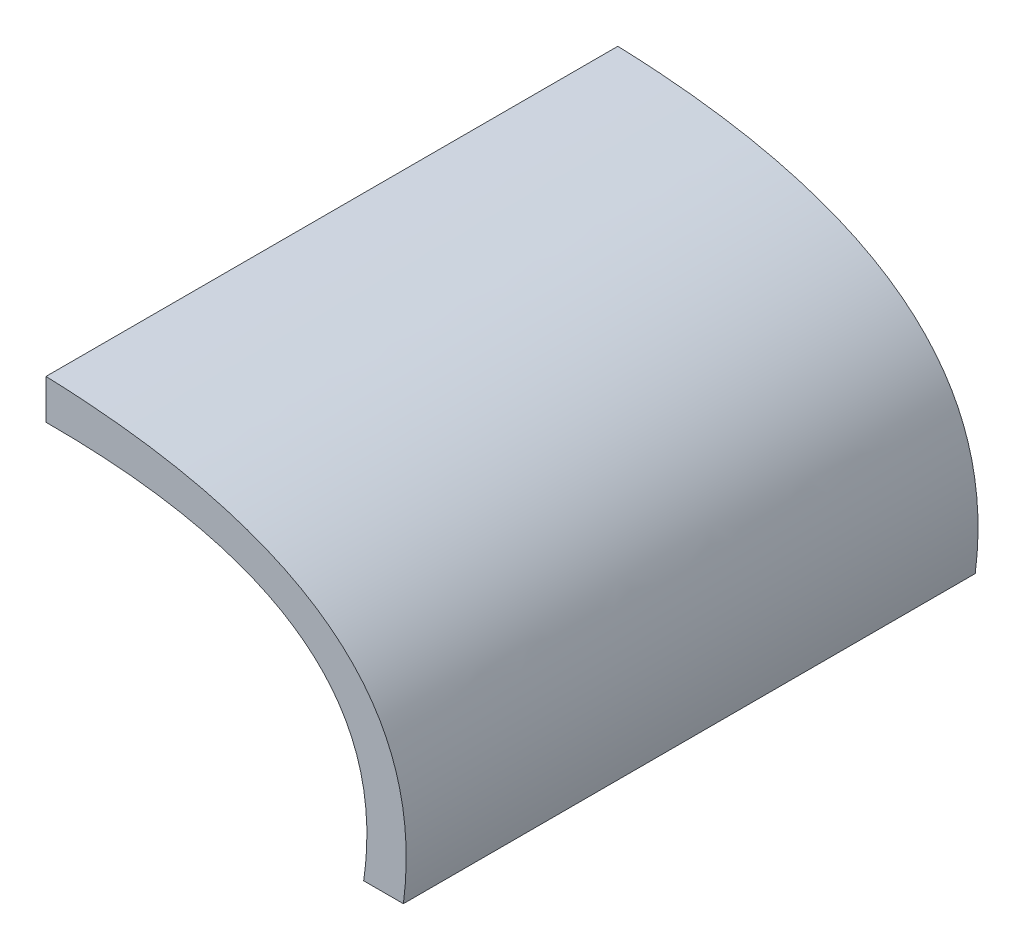
ISO-10303-21;
HEADER;
FILE_DESCRIPTION(('STEP AP214'),'2;1');
FILE_NAME('part.step','',(''),(''),'','','');
FILE_SCHEMA(('AUTOMOTIVE_DESIGN { 1 0 10303 214 1 1 1 1 }'));
ENDSEC;
DATA;
#1=APPLICATION_CONTEXT('core data for automotive mechanical design processes');
#2=APPLICATION_PROTOCOL_DEFINITION('international standard','automotive_design',2000,#1);
#3=PRODUCT_CONTEXT('',#1,'mechanical');
#4=PRODUCT('Part','Part','',(#3));
#5=PRODUCT_RELATED_PRODUCT_CATEGORY('part','',(#4));
#6=PRODUCT_DEFINITION_FORMATION('','',#4);
#7=PRODUCT_DEFINITION_CONTEXT('part definition',#1,'design');
#8=PRODUCT_DEFINITION('design','',#6,#7);
#9=PRODUCT_DEFINITION_SHAPE('','',#8);
#10=(LENGTH_UNIT() NAMED_UNIT(*) SI_UNIT(.MILLI.,.METRE.));
#11=(NAMED_UNIT(*) PLANE_ANGLE_UNIT() SI_UNIT($,.RADIAN.));
#12=(NAMED_UNIT(*) SI_UNIT($,.STERADIAN.) SOLID_ANGLE_UNIT());
#13=UNCERTAINTY_MEASURE_WITH_UNIT(LENGTH_MEASURE(1.E-05),#10,'distance_accuracy_value','');
#14=(GEOMETRIC_REPRESENTATION_CONTEXT(3) GLOBAL_UNCERTAINTY_ASSIGNED_CONTEXT((#13)) GLOBAL_UNIT_ASSIGNED_CONTEXT((#10,
#11,#12)) REPRESENTATION_CONTEXT('',''));
#15=CARTESIAN_POINT('',(0.,0.,0.));
#16=DIRECTION('',(0.,0.,1.));
#17=DIRECTION('',(1.,0.,0.));
#18=AXIS2_PLACEMENT_3D('',#15,#16,#17);
#19=CARTESIAN_POINT('',(45.,0.,72.));
#20=CARTESIAN_POINT('',(49.3707863806077,33.3108606965743,72.));
#21=CARTESIAN_POINT('',(0.,35.,72.));
#22=B_SPLINE_CURVE_WITH_KNOTS('',2,(#19,#20,#21),.UNSPECIFIED.,.F.,.F.,(3,3),(0.,1.),.UNSPECIFIED.);
#23=DIRECTION('',(0.,0.,-1.));
#24=VECTOR('',#23,1.);
#25=SURFACE_OF_LINEAR_EXTRUSION('',#22,#24);
#26=CARTESIAN_POINT('',(45.,0.,0.));
#27=CARTESIAN_POINT('',(49.3707863806077,33.3108606965743,0.));
#28=CARTESIAN_POINT('',(0.,35.,0.));
#29=B_SPLINE_CURVE_WITH_KNOTS('',2,(#26,#27,#28),.UNSPECIFIED.,.F.,.F.,(3,3),(0.,1.),.UNSPECIFIED.);
#30=CARTESIAN_POINT('',(45.,0.,0.));
#31=VERTEX_POINT('',#30);
#32=CARTESIAN_POINT('',(0.,35.,0.));
#33=VERTEX_POINT('',#32);
#34=EDGE_CURVE('E116',#31,#33,#29,.T.);
#35=ORIENTED_EDGE('',*,*,#34,.T.);
#36=DIRECTION('',(0.,0.,-1.));
#37=VECTOR('',#36,1.);
#38=CARTESIAN_POINT('',(0.,35.,72.));
#39=LINE('',#38,#37);
#40=CARTESIAN_POINT('',(0.,35.,72.));
#41=VERTEX_POINT('',#40);
#42=EDGE_CURVE('E11',#41,#33,#39,.T.);
#43=ORIENTED_EDGE('',*,*,#42,.F.);
#44=CARTESIAN_POINT('',(45.,0.,72.));
#45=VERTEX_POINT('',#44);
#46=EDGE_CURVE('E85',#45,#41,#22,.T.);
#47=ORIENTED_EDGE('',*,*,#46,.F.);
#48=DIRECTION('',(0.,0.,-1.));
#49=VECTOR('',#48,1.);
#50=CARTESIAN_POINT('',(45.,0.,72.));
#51=LINE('',#50,#49);
#52=EDGE_CURVE('E93',#45,#31,#51,.T.);
#53=ORIENTED_EDGE('',*,*,#52,.T.);
#54=EDGE_LOOP('',(#35,#43,#47,#53));
#55=FACE_BOUND('',#54,.T.);
#56=ADVANCED_FACE('F33',(#55),#25,.F.);
#57=CARTESIAN_POINT('',(0.,35.,72.));
#58=DIRECTION('',(1.,0.,0.));
#59=DIRECTION('',(0.,1.,0.));
#60=AXIS2_PLACEMENT_3D('',#57,#58,#59);
#61=PLANE('',#60);
#62=DIRECTION('',(0.,-1.,0.));
#63=VECTOR('',#62,1.);
#64=CARTESIAN_POINT('',(0.,35.,0.));
#65=LINE('',#64,#63);
#66=CARTESIAN_POINT('',(0.,30.,0.));
#67=VERTEX_POINT('',#66);
#68=EDGE_CURVE('E89',#33,#67,#65,.T.);
#69=ORIENTED_EDGE('',*,*,#68,.T.);
#70=DIRECTION('',(0.,0.,-1.));
#71=VECTOR('',#70,1.);
#72=CARTESIAN_POINT('',(0.,30.,72.));
#73=LINE('',#72,#71);
#74=CARTESIAN_POINT('',(0.,30.,72.));
#75=VERTEX_POINT('',#74);
#76=EDGE_CURVE('E42',#75,#67,#73,.T.);
#77=ORIENTED_EDGE('',*,*,#76,.F.);
#78=DIRECTION('',(0.,-1.,0.));
#79=VECTOR('',#78,1.);
#80=CARTESIAN_POINT('',(0.,35.,72.));
#81=LINE('',#80,#79);
#82=EDGE_CURVE('E80',#41,#75,#81,.T.);
#83=ORIENTED_EDGE('',*,*,#82,.F.);
#84=ORIENTED_EDGE('',*,*,#42,.T.);
#85=EDGE_LOOP('',(#69,#77,#83,#84));
#86=FACE_BOUND('',#85,.T.);
#87=ADVANCED_FACE('F88',(#86),#61,.F.);
#88=CARTESIAN_POINT('',(0.,30.,72.));
#89=CARTESIAN_POINT('',(44.4721359549996,30.1246117974981,72.));
#90=CARTESIAN_POINT('',(40.,0.,72.));
#91=B_SPLINE_CURVE_WITH_KNOTS('',2,(#88,#89,#90),.UNSPECIFIED.,.F.,.F.,(3,3),(0.,1.),.UNSPECIFIED.);
#92=DIRECTION('',(0.,0.,-1.));
#93=VECTOR('',#92,1.);
#94=SURFACE_OF_LINEAR_EXTRUSION('',#91,#93);
#95=CARTESIAN_POINT('',(0.,30.,0.));
#96=CARTESIAN_POINT('',(44.4721359549996,30.1246117974981,0.));
#97=CARTESIAN_POINT('',(40.,0.,0.));
#98=B_SPLINE_CURVE_WITH_KNOTS('',2,(#95,#96,#97),.UNSPECIFIED.,.F.,.F.,(3,3),(0.,1.),.UNSPECIFIED.);
#99=CARTESIAN_POINT('',(40.,0.,0.));
#100=VERTEX_POINT('',#99);
#101=EDGE_CURVE('E67',#67,#100,#98,.T.);
#102=ORIENTED_EDGE('',*,*,#101,.T.);
#103=DIRECTION('',(0.,0.,-1.));
#104=VECTOR('',#103,1.);
#105=CARTESIAN_POINT('',(40.,0.,72.));
#106=LINE('',#105,#104);
#107=CARTESIAN_POINT('',(40.,0.,72.));
#108=VERTEX_POINT('',#107);
#109=EDGE_CURVE('E90',#108,#100,#106,.T.);
#110=ORIENTED_EDGE('',*,*,#109,.F.);
#111=EDGE_CURVE('E83',#75,#108,#91,.T.);
#112=ORIENTED_EDGE('',*,*,#111,.F.);
#113=ORIENTED_EDGE('',*,*,#76,.T.);
#114=EDGE_LOOP('',(#102,#110,#112,#113));
#115=FACE_BOUND('',#114,.T.);
#116=ADVANCED_FACE('F91',(#115),#94,.F.);
#117=CARTESIAN_POINT('',(40.,0.,72.));
#118=DIRECTION('',(0.,1.,0.));
#119=DIRECTION('',(-1.,0.,0.));
#120=AXIS2_PLACEMENT_3D('',#117,#118,#119);
#121=PLANE('',#120);
#122=DIRECTION('',(1.,0.,0.));
#123=VECTOR('',#122,1.);
#124=CARTESIAN_POINT('',(40.,0.,0.));
#125=LINE('',#124,#123);
#126=EDGE_CURVE('E73',#100,#31,#125,.T.);
#127=ORIENTED_EDGE('',*,*,#126,.T.);
#128=ORIENTED_EDGE('',*,*,#52,.F.);
#129=DIRECTION('',(1.,0.,0.));
#130=VECTOR('',#129,1.);
#131=CARTESIAN_POINT('',(40.,0.,72.));
#132=LINE('',#131,#130);
#133=EDGE_CURVE('E50',#108,#45,#132,.T.);
#134=ORIENTED_EDGE('',*,*,#133,.F.);
#135=ORIENTED_EDGE('',*,*,#109,.T.);
#136=EDGE_LOOP('',(#127,#128,#134,#135));
#137=FACE_BOUND('',#136,.T.);
#138=ADVANCED_FACE('F105',(#137),#121,.F.);
#139=CARTESIAN_POINT('',(35.9353931903038,25.4054303482872,72.));
#140=DIRECTION('',(0.,0.,1.));
#141=DIRECTION('',(1.,0.,0.));
#142=AXIS2_PLACEMENT_3D('',#139,#140,#141);
#143=PLANE('',#142);
#144=ORIENTED_EDGE('',*,*,#46,.T.);
#145=ORIENTED_EDGE('',*,*,#82,.T.);
#146=ORIENTED_EDGE('',*,*,#111,.T.);
#147=ORIENTED_EDGE('',*,*,#133,.T.);
#148=EDGE_LOOP('',(#144,#145,#146,#147));
#149=FACE_BOUND('',#148,.T.);
#150=ADVANCED_FACE('F81',(#149),#143,.T.);
#151=CARTESIAN_POINT('',(35.9353931903038,25.4054303482872,0.));
#152=DIRECTION('',(0.,0.,1.));
#153=DIRECTION('',(1.,0.,0.));
#154=AXIS2_PLACEMENT_3D('',#151,#152,#153);
#155=PLANE('',#154);
#156=ORIENTED_EDGE('',*,*,#34,.F.);
#157=ORIENTED_EDGE('',*,*,#126,.F.);
#158=ORIENTED_EDGE('',*,*,#101,.F.);
#159=ORIENTED_EDGE('',*,*,#68,.F.);
#160=EDGE_LOOP('',(#156,#157,#158,#159));
#161=FACE_BOUND('',#160,.T.);
#162=ADVANCED_FACE('F133',(#161),#155,.F.);
#163=CLOSED_SHELL('',(#56,#87,#116,#138,#150,#162));
#164=MANIFOLD_SOLID_BREP('B2',#163);
#165=ADVANCED_BREP_SHAPE_REPRESENTATION('',(#18,#164),#14);
#166=SHAPE_DEFINITION_REPRESENTATION(#9,#165);
ENDSEC;
END-ISO-10303-21;
